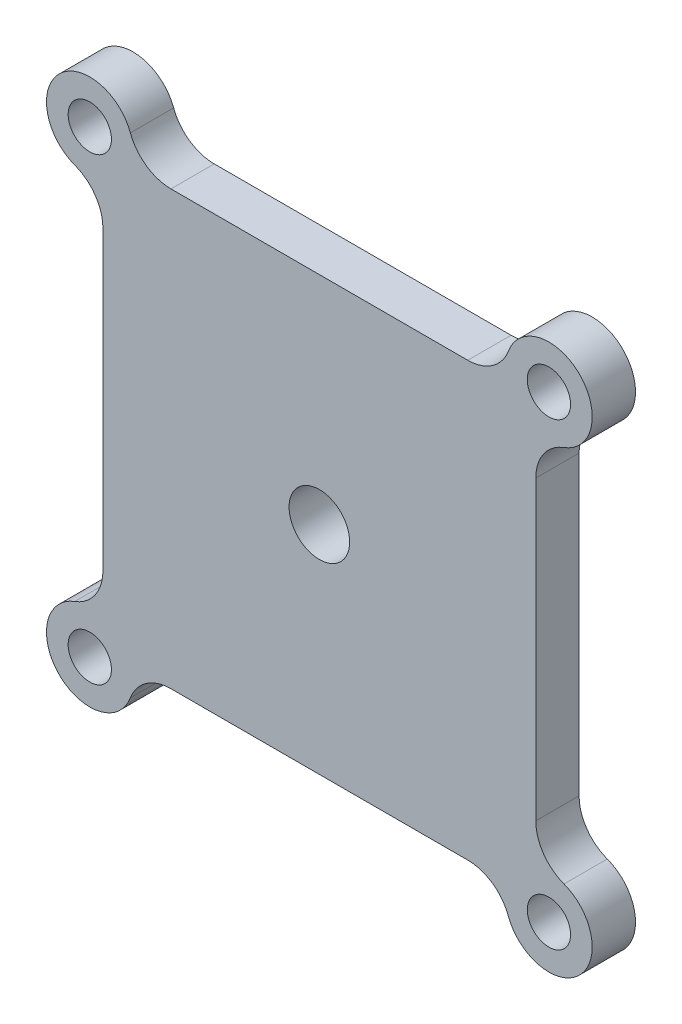
ISO-10303-21;
HEADER;
FILE_DESCRIPTION(('STEP AP214'),'2;1');
FILE_NAME('part.step','',(''),(''),'','','');
FILE_SCHEMA(('AUTOMOTIVE_DESIGN { 1 0 10303 214 1 1 1 1 }'));
ENDSEC;
DATA;
#1=APPLICATION_CONTEXT('core data for automotive mechanical design processes');
#2=APPLICATION_PROTOCOL_DEFINITION('international standard','automotive_design',2000,#1);
#3=PRODUCT_CONTEXT('',#1,'mechanical');
#4=PRODUCT('Part','Part','',(#3));
#5=PRODUCT_RELATED_PRODUCT_CATEGORY('part','',(#4));
#6=PRODUCT_DEFINITION_FORMATION('','',#4);
#7=PRODUCT_DEFINITION_CONTEXT('part definition',#1,'design');
#8=PRODUCT_DEFINITION('design','',#6,#7);
#9=PRODUCT_DEFINITION_SHAPE('','',#8);
#10=(LENGTH_UNIT() NAMED_UNIT(*) SI_UNIT(.MILLI.,.METRE.));
#11=(NAMED_UNIT(*) PLANE_ANGLE_UNIT() SI_UNIT($,.RADIAN.));
#12=(NAMED_UNIT(*) SI_UNIT($,.STERADIAN.) SOLID_ANGLE_UNIT());
#13=UNCERTAINTY_MEASURE_WITH_UNIT(LENGTH_MEASURE(1.E-05),#10,'distance_accuracy_value','');
#14=(GEOMETRIC_REPRESENTATION_CONTEXT(3) GLOBAL_UNCERTAINTY_ASSIGNED_CONTEXT((#13)) GLOBAL_UNIT_ASSIGNED_CONTEXT((#10,
#11,#12)) REPRESENTATION_CONTEXT('',''));
#15=CARTESIAN_POINT('',(0.,0.,0.));
#16=DIRECTION('',(0.,0.,1.));
#17=DIRECTION('',(1.,0.,0.));
#18=AXIS2_PLACEMENT_3D('',#15,#16,#17);
#19=CARTESIAN_POINT('',(-17.1428573163983,30.,5.));
#20=DIRECTION('',(0.,0.,-1.));
#21=DIRECTION('',(-1.,0.,0.));
#22=AXIS2_PLACEMENT_3D('',#19,#20,#21);
#23=PLANE('',#22);
#24=CARTESIAN_POINT('',(-17.1428573163983,30.,5.));
#25=DIRECTION('',(0.,0.,-1.));
#26=DIRECTION('',(-1.,0.,0.));
#27=AXIS2_PLACEMENT_3D('',#24,#25,#26);
#28=CIRCLE('',#27,5.);
#29=CARTESIAN_POINT('',(-17.1428573163983,25.,5.));
#30=VERTEX_POINT('',#29);
#31=CARTESIAN_POINT('',(-21.8296808054419,28.2582521472528,5.));
#32=VERTEX_POINT('',#31);
#33=EDGE_CURVE('E215',#30,#32,#28,.T.);
#34=ORIENTED_EDGE('',*,*,#33,.T.);
#35=CARTESIAN_POINT('',(-26.5165042944855,26.5165042945056,5.));
#36=DIRECTION('',(0.,0.,1.));
#37=DIRECTION('',(1.,0.,0.));
#38=AXIS2_PLACEMENT_3D('',#35,#36,#37);
#39=CIRCLE('',#38,5.);
#40=CARTESIAN_POINT('',(-28.2582521472427,21.8296808054658,5.));
#41=VERTEX_POINT('',#40);
#42=EDGE_CURVE('E123',#32,#41,#39,.T.);
#43=ORIENTED_EDGE('',*,*,#42,.T.);
#44=CARTESIAN_POINT('',(-30.,17.142857316426,5.));
#45=DIRECTION('',(0.,0.,-1.));
#46=DIRECTION('',(1.,0.,0.));
#47=AXIS2_PLACEMENT_3D('',#44,#45,#46);
#48=CIRCLE('',#47,5.);
#49=CARTESIAN_POINT('',(-25.,17.142857316426,5.));
#50=VERTEX_POINT('',#49);
#51=EDGE_CURVE('E254',#41,#50,#48,.T.);
#52=ORIENTED_EDGE('',*,*,#51,.T.);
#53=DIRECTION('',(0.,-1.,0.));
#54=VECTOR('',#53,1.);
#55=CARTESIAN_POINT('',(-25.0000000000002,-17.142857316398,5.));
#56=LINE('',#55,#54);
#57=CARTESIAN_POINT('',(-25.0000000000002,-17.142857316398,5.));
#58=VERTEX_POINT('',#57);
#59=EDGE_CURVE('E273',#50,#58,#56,.T.);
#60=ORIENTED_EDGE('',*,*,#59,.T.);
#61=CARTESIAN_POINT('',(-30.0000000000002,-17.142857316398,5.));
#62=DIRECTION('',(0.,0.,-1.));
#63=DIRECTION('',(-1.,0.,0.));
#64=AXIS2_PLACEMENT_3D('',#61,#62,#63);
#65=CIRCLE('',#64,5.);
#66=CARTESIAN_POINT('',(-28.258252147253,-21.8296808054416,5.));
#67=VERTEX_POINT('',#66);
#68=EDGE_CURVE('E270',#58,#67,#65,.T.);
#69=ORIENTED_EDGE('',*,*,#68,.T.);
#70=CARTESIAN_POINT('',(-26.5165042945059,-26.5165042944852,5.));
#71=DIRECTION('',(0.,0.,1.));
#72=DIRECTION('',(1.,0.,0.));
#73=AXIS2_PLACEMENT_3D('',#70,#71,#72);
#74=CIRCLE('',#73,5.);
#75=CARTESIAN_POINT('',(-21.8296808054661,-28.2582521472425,5.));
#76=VERTEX_POINT('',#75);
#77=EDGE_CURVE('E272',#67,#76,#74,.T.);
#78=ORIENTED_EDGE('',*,*,#77,.T.);
#79=CARTESIAN_POINT('',(-17.1428573164263,-29.9999999999998,5.));
#80=DIRECTION('',(0.,0.,-1.));
#81=DIRECTION('',(1.,0.,0.));
#82=AXIS2_PLACEMENT_3D('',#79,#80,#81);
#83=CIRCLE('',#82,5.);
#84=CARTESIAN_POINT('',(-17.1428573164262,-24.9999999999998,5.));
#85=VERTEX_POINT('',#84);
#86=EDGE_CURVE('E275',#76,#85,#83,.T.);
#87=ORIENTED_EDGE('',*,*,#86,.T.);
#88=DIRECTION('',(1.,0.,0.));
#89=VECTOR('',#88,1.);
#90=CARTESIAN_POINT('',(-17.1428573164262,-24.9999999999998,5.));
#91=LINE('',#90,#89);
#92=CARTESIAN_POINT('',(17.1428573163981,-25.0000000000001,5.));
#93=VERTEX_POINT('',#92);
#94=EDGE_CURVE('E281',#85,#93,#91,.T.);
#95=ORIENTED_EDGE('',*,*,#94,.T.);
#96=CARTESIAN_POINT('',(17.1428573163981,-30.0000000000001,5.));
#97=DIRECTION('',(0.,0.,-1.));
#98=DIRECTION('',(-1.,0.,0.));
#99=AXIS2_PLACEMENT_3D('',#96,#97,#98);
#100=CIRCLE('',#99,5.);
#101=CARTESIAN_POINT('',(21.8296808054417,-28.258252147253,5.));
#102=VERTEX_POINT('',#101);
#103=EDGE_CURVE('E283',#93,#102,#100,.T.);
#104=ORIENTED_EDGE('',*,*,#103,.T.);
#105=CARTESIAN_POINT('',(26.5165042944853,-26.5165042945058,5.));
#106=DIRECTION('',(0.,0.,1.));
#107=DIRECTION('',(1.,0.,0.));
#108=AXIS2_PLACEMENT_3D('',#105,#106,#107);
#109=CIRCLE('',#108,5.);
#110=CARTESIAN_POINT('',(28.2582521472426,-21.829680805466,5.));
#111=VERTEX_POINT('',#110);
#112=EDGE_CURVE('E285',#102,#111,#109,.T.);
#113=ORIENTED_EDGE('',*,*,#112,.T.);
#114=CARTESIAN_POINT('',(29.9999999999999,-17.1428573164262,5.));
#115=DIRECTION('',(0.,0.,-1.));
#116=DIRECTION('',(1.,0.,0.));
#117=AXIS2_PLACEMENT_3D('',#114,#115,#116);
#118=CIRCLE('',#117,5.);
#119=CARTESIAN_POINT('',(24.9999999999999,-17.1428573164262,5.));
#120=VERTEX_POINT('',#119);
#121=EDGE_CURVE('E287',#111,#120,#118,.T.);
#122=ORIENTED_EDGE('',*,*,#121,.T.);
#123=DIRECTION('',(0.,1.,0.));
#124=VECTOR('',#123,1.);
#125=CARTESIAN_POINT('',(24.9999999999999,-17.1428573164262,5.));
#126=LINE('',#125,#124);
#127=CARTESIAN_POINT('',(25.0000000000001,17.1428573163982,5.));
#128=VERTEX_POINT('',#127);
#129=EDGE_CURVE('E289',#120,#128,#126,.T.);
#130=ORIENTED_EDGE('',*,*,#129,.T.);
#131=CARTESIAN_POINT('',(30.0000000000001,17.1428573163982,5.));
#132=DIRECTION('',(0.,0.,-1.));
#133=DIRECTION('',(-1.,0.,0.));
#134=AXIS2_PLACEMENT_3D('',#131,#132,#133);
#135=CIRCLE('',#134,5.);
#136=CARTESIAN_POINT('',(28.2582521472529,21.8296808054418,5.));
#137=VERTEX_POINT('',#136);
#138=EDGE_CURVE('E166',#128,#137,#135,.T.);
#139=ORIENTED_EDGE('',*,*,#138,.T.);
#140=CARTESIAN_POINT('',(26.5165042945057,26.5165042944854,5.));
#141=DIRECTION('',(0.,0.,1.));
#142=DIRECTION('',(1.,0.,0.));
#143=AXIS2_PLACEMENT_3D('',#140,#141,#142);
#144=CIRCLE('',#143,5.);
#145=CARTESIAN_POINT('',(21.8296808054659,28.2582521472426,5.));
#146=VERTEX_POINT('',#145);
#147=EDGE_CURVE('E160',#137,#146,#144,.T.);
#148=ORIENTED_EDGE('',*,*,#147,.T.);
#149=CARTESIAN_POINT('',(17.1428573164261,29.9999999999999,5.));
#150=DIRECTION('',(0.,0.,-1.));
#151=DIRECTION('',(1.,0.,0.));
#152=AXIS2_PLACEMENT_3D('',#149,#150,#151);
#153=CIRCLE('',#152,5.);
#154=CARTESIAN_POINT('',(17.1428573164261,24.9999999999999,5.));
#155=VERTEX_POINT('',#154);
#156=EDGE_CURVE('E164',#146,#155,#153,.T.);
#157=ORIENTED_EDGE('',*,*,#156,.T.);
#158=DIRECTION('',(-1.,0.,0.));
#159=VECTOR('',#158,1.);
#160=CARTESIAN_POINT('',(-17.1428573163983,25.,5.));
#161=LINE('',#160,#159);
#162=EDGE_CURVE('E56',#155,#30,#161,.T.);
#163=ORIENTED_EDGE('',*,*,#162,.T.);
#164=EDGE_LOOP('',(#34,#43,#52,#60,#69,#78,#87,#95,#104,#113,#122,#130,#139,#148,#157,#163));
#165=FACE_BOUND('',#164,.T.);
#166=CARTESIAN_POINT('',(0.,0.,5.));
#167=DIRECTION('',(0.,0.,1.));
#168=DIRECTION('',(1.,0.,0.));
#169=AXIS2_PLACEMENT_3D('',#166,#167,#168);
#170=CIRCLE('',#169,3.5);
#171=CARTESIAN_POINT('',(3.5,0.,5.));
#172=VERTEX_POINT('',#171);
#173=EDGE_CURVE('E188',#172,#172,#170,.T.);
#174=ORIENTED_EDGE('',*,*,#173,.F.);
#175=EDGE_LOOP('',(#174));
#176=FACE_BOUND('',#175,.T.);
#177=CARTESIAN_POINT('',(-26.5165042944855,26.5165042945056,5.));
#178=DIRECTION('',(0.,0.,1.));
#179=DIRECTION('',(1.,0.,0.));
#180=AXIS2_PLACEMENT_3D('',#177,#178,#179);
#181=CIRCLE('',#180,2.5);
#182=CARTESIAN_POINT('',(-24.0165042944855,26.5165042945056,5.));
#183=VERTEX_POINT('',#182);
#184=EDGE_CURVE('E363',#183,#183,#181,.T.);
#185=ORIENTED_EDGE('',*,*,#184,.F.);
#186=EDGE_LOOP('',(#185));
#187=FACE_BOUND('',#186,.T.);
#188=CARTESIAN_POINT('',(26.5165042945057,26.5165042944854,5.));
#189=DIRECTION('',(0.,0.,1.));
#190=DIRECTION('',(1.,0.,0.));
#191=AXIS2_PLACEMENT_3D('',#188,#189,#190);
#192=CIRCLE('',#191,2.5);
#193=CARTESIAN_POINT('',(29.0165042945057,26.5165042944854,5.));
#194=VERTEX_POINT('',#193);
#195=EDGE_CURVE('E357',#194,#194,#192,.T.);
#196=ORIENTED_EDGE('',*,*,#195,.F.);
#197=EDGE_LOOP('',(#196));
#198=FACE_BOUND('',#197,.T.);
#199=CARTESIAN_POINT('',(26.5165042944853,-26.5165042945058,5.));
#200=DIRECTION('',(0.,0.,1.));
#201=DIRECTION('',(1.,0.,0.));
#202=AXIS2_PLACEMENT_3D('',#199,#200,#201);
#203=CIRCLE('',#202,2.5);
#204=CARTESIAN_POINT('',(29.0165042944853,-26.5165042945058,5.));
#205=VERTEX_POINT('',#204);
#206=EDGE_CURVE('E351',#205,#205,#203,.T.);
#207=ORIENTED_EDGE('',*,*,#206,.F.);
#208=EDGE_LOOP('',(#207));
#209=FACE_BOUND('',#208,.T.);
#210=CARTESIAN_POINT('',(-26.5165042945059,-26.5165042944852,5.));
#211=DIRECTION('',(0.,0.,1.));
#212=DIRECTION('',(1.,0.,0.));
#213=AXIS2_PLACEMENT_3D('',#210,#211,#212);
#214=CIRCLE('',#213,2.5);
#215=CARTESIAN_POINT('',(-24.0165042945059,-26.5165042944852,5.));
#216=VERTEX_POINT('',#215);
#217=EDGE_CURVE('E342',#216,#216,#214,.T.);
#218=ORIENTED_EDGE('',*,*,#217,.F.);
#219=EDGE_LOOP('',(#218));
#220=FACE_BOUND('',#219,.T.);
#221=ADVANCED_FACE('F39',(#165,#176,#187,#198,#209,#220),#23,.F.);
#222=CARTESIAN_POINT('',(-17.1428573163983,30.,0.));
#223=DIRECTION('',(0.,0.,-1.));
#224=DIRECTION('',(-1.,0.,0.));
#225=AXIS2_PLACEMENT_3D('',#222,#223,#224);
#226=PLANE('',#225);
#227=CARTESIAN_POINT('',(26.5165042944853,-26.5165042945058,0.));
#228=DIRECTION('',(0.,0.,1.));
#229=DIRECTION('',(1.,0.,0.));
#230=AXIS2_PLACEMENT_3D('',#227,#228,#229);
#231=CIRCLE('',#230,2.5);
#232=CARTESIAN_POINT('',(29.0165042944853,-26.5165042945058,0.));
#233=VERTEX_POINT('',#232);
#234=EDGE_CURVE('E348',#233,#233,#231,.T.);
#235=ORIENTED_EDGE('',*,*,#234,.T.);
#236=EDGE_LOOP('',(#235));
#237=FACE_BOUND('',#236,.T.);
#238=CARTESIAN_POINT('',(-26.5165042944855,26.5165042945056,0.));
#239=DIRECTION('',(0.,0.,1.));
#240=DIRECTION('',(1.,0.,0.));
#241=AXIS2_PLACEMENT_3D('',#238,#239,#240);
#242=CIRCLE('',#241,2.5);
#243=CARTESIAN_POINT('',(-24.0165042944855,26.5165042945056,0.));
#244=VERTEX_POINT('',#243);
#245=EDGE_CURVE('E360',#244,#244,#242,.T.);
#246=ORIENTED_EDGE('',*,*,#245,.T.);
#247=EDGE_LOOP('',(#246));
#248=FACE_BOUND('',#247,.T.);
#249=CARTESIAN_POINT('',(-17.1428573163983,30.,0.));
#250=DIRECTION('',(0.,0.,-1.));
#251=DIRECTION('',(-1.,0.,0.));
#252=AXIS2_PLACEMENT_3D('',#249,#250,#251);
#253=CIRCLE('',#252,5.);
#254=CARTESIAN_POINT('',(-17.1428573163983,25.,0.));
#255=VERTEX_POINT('',#254);
#256=CARTESIAN_POINT('',(-21.8296808054419,28.2582521472528,0.));
#257=VERTEX_POINT('',#256);
#258=EDGE_CURVE('E184',#255,#257,#253,.T.);
#259=ORIENTED_EDGE('',*,*,#258,.F.);
#260=DIRECTION('',(-1.,0.,0.));
#261=VECTOR('',#260,1.);
#262=CARTESIAN_POINT('',(-17.1428573163983,25.,0.));
#263=LINE('',#262,#261);
#264=CARTESIAN_POINT('',(17.1428573164261,24.9999999999999,0.));
#265=VERTEX_POINT('',#264);
#266=EDGE_CURVE('E115',#265,#255,#263,.T.);
#267=ORIENTED_EDGE('',*,*,#266,.F.);
#268=CARTESIAN_POINT('',(17.1428573164261,29.9999999999999,0.));
#269=DIRECTION('',(0.,0.,-1.));
#270=DIRECTION('',(1.,0.,0.));
#271=AXIS2_PLACEMENT_3D('',#268,#269,#270);
#272=CIRCLE('',#271,5.);
#273=CARTESIAN_POINT('',(21.8296808054659,28.2582521472426,0.));
#274=VERTEX_POINT('',#273);
#275=EDGE_CURVE('E109',#274,#265,#272,.T.);
#276=ORIENTED_EDGE('',*,*,#275,.F.);
#277=CARTESIAN_POINT('',(26.5165042945057,26.5165042944854,0.));
#278=DIRECTION('',(0.,0.,1.));
#279=DIRECTION('',(1.,0.,0.));
#280=AXIS2_PLACEMENT_3D('',#277,#278,#279);
#281=CIRCLE('',#280,5.);
#282=CARTESIAN_POINT('',(28.2582521472529,21.8296808054418,0.));
#283=VERTEX_POINT('',#282);
#284=EDGE_CURVE('E174',#283,#274,#281,.T.);
#285=ORIENTED_EDGE('',*,*,#284,.F.);
#286=CARTESIAN_POINT('',(30.0000000000001,17.1428573163982,0.));
#287=DIRECTION('',(0.,0.,-1.));
#288=DIRECTION('',(-1.,0.,0.));
#289=AXIS2_PLACEMENT_3D('',#286,#287,#288);
#290=CIRCLE('',#289,5.);
#291=CARTESIAN_POINT('',(25.0000000000001,17.1428573163982,0.));
#292=VERTEX_POINT('',#291);
#293=EDGE_CURVE('E210',#292,#283,#290,.T.);
#294=ORIENTED_EDGE('',*,*,#293,.F.);
#295=DIRECTION('',(0.,1.,0.));
#296=VECTOR('',#295,1.);
#297=CARTESIAN_POINT('',(24.9999999999999,-17.1428573164262,0.));
#298=LINE('',#297,#296);
#299=CARTESIAN_POINT('',(24.9999999999999,-17.1428573164262,0.));
#300=VERTEX_POINT('',#299);
#301=EDGE_CURVE('E208',#300,#292,#298,.T.);
#302=ORIENTED_EDGE('',*,*,#301,.F.);
#303=CARTESIAN_POINT('',(29.9999999999999,-17.1428573164262,0.));
#304=DIRECTION('',(0.,0.,-1.));
#305=DIRECTION('',(1.,0.,0.));
#306=AXIS2_PLACEMENT_3D('',#303,#304,#305);
#307=CIRCLE('',#306,5.);
#308=CARTESIAN_POINT('',(28.2582521472426,-21.829680805466,0.));
#309=VERTEX_POINT('',#308);
#310=EDGE_CURVE('E206',#309,#300,#307,.T.);
#311=ORIENTED_EDGE('',*,*,#310,.F.);
#312=CARTESIAN_POINT('',(26.5165042944853,-26.5165042945058,0.));
#313=DIRECTION('',(0.,0.,1.));
#314=DIRECTION('',(1.,0.,0.));
#315=AXIS2_PLACEMENT_3D('',#312,#313,#314);
#316=CIRCLE('',#315,5.);
#317=CARTESIAN_POINT('',(21.8296808054417,-28.258252147253,0.));
#318=VERTEX_POINT('',#317);
#319=EDGE_CURVE('E204',#318,#309,#316,.T.);
#320=ORIENTED_EDGE('',*,*,#319,.F.);
#321=CARTESIAN_POINT('',(17.1428573163981,-30.0000000000001,0.));
#322=DIRECTION('',(0.,0.,-1.));
#323=DIRECTION('',(-1.,0.,0.));
#324=AXIS2_PLACEMENT_3D('',#321,#322,#323);
#325=CIRCLE('',#324,5.);
#326=CARTESIAN_POINT('',(17.1428573163981,-25.0000000000001,0.));
#327=VERTEX_POINT('',#326);
#328=EDGE_CURVE('E202',#327,#318,#325,.T.);
#329=ORIENTED_EDGE('',*,*,#328,.F.);
#330=DIRECTION('',(1.,0.,0.));
#331=VECTOR('',#330,1.);
#332=CARTESIAN_POINT('',(-17.1428573164262,-24.9999999999998,0.));
#333=LINE('',#332,#331);
#334=CARTESIAN_POINT('',(-17.1428573164262,-24.9999999999998,0.));
#335=VERTEX_POINT('',#334);
#336=EDGE_CURVE('E200',#335,#327,#333,.T.);
#337=ORIENTED_EDGE('',*,*,#336,.F.);
#338=CARTESIAN_POINT('',(-17.1428573164263,-29.9999999999998,0.));
#339=DIRECTION('',(0.,0.,-1.));
#340=DIRECTION('',(1.,0.,0.));
#341=AXIS2_PLACEMENT_3D('',#338,#339,#340);
#342=CIRCLE('',#341,5.);
#343=CARTESIAN_POINT('',(-21.8296808054661,-28.2582521472425,0.));
#344=VERTEX_POINT('',#343);
#345=EDGE_CURVE('E198',#344,#335,#342,.T.);
#346=ORIENTED_EDGE('',*,*,#345,.F.);
#347=CARTESIAN_POINT('',(-26.5165042945059,-26.5165042944852,0.));
#348=DIRECTION('',(0.,0.,1.));
#349=DIRECTION('',(1.,0.,0.));
#350=AXIS2_PLACEMENT_3D('',#347,#348,#349);
#351=CIRCLE('',#350,5.);
#352=CARTESIAN_POINT('',(-28.258252147253,-21.8296808054416,0.));
#353=VERTEX_POINT('',#352);
#354=EDGE_CURVE('E196',#353,#344,#351,.T.);
#355=ORIENTED_EDGE('',*,*,#354,.F.);
#356=CARTESIAN_POINT('',(-30.0000000000002,-17.142857316398,0.));
#357=DIRECTION('',(0.,0.,-1.));
#358=DIRECTION('',(-1.,0.,0.));
#359=AXIS2_PLACEMENT_3D('',#356,#357,#358);
#360=CIRCLE('',#359,5.);
#361=CARTESIAN_POINT('',(-25.0000000000002,-17.142857316398,0.));
#362=VERTEX_POINT('',#361);
#363=EDGE_CURVE('E194',#362,#353,#360,.T.);
#364=ORIENTED_EDGE('',*,*,#363,.F.);
#365=DIRECTION('',(0.,-1.,0.));
#366=VECTOR('',#365,1.);
#367=CARTESIAN_POINT('',(-25.0000000000002,-17.142857316398,0.));
#368=LINE('',#367,#366);
#369=CARTESIAN_POINT('',(-25.,17.142857316426,0.));
#370=VERTEX_POINT('',#369);
#371=EDGE_CURVE('E192',#370,#362,#368,.T.);
#372=ORIENTED_EDGE('',*,*,#371,.F.);
#373=CARTESIAN_POINT('',(-30.,17.142857316426,0.));
#374=DIRECTION('',(0.,0.,-1.));
#375=DIRECTION('',(1.,0.,0.));
#376=AXIS2_PLACEMENT_3D('',#373,#374,#375);
#377=CIRCLE('',#376,5.);
#378=CARTESIAN_POINT('',(-28.2582521472427,21.8296808054658,0.));
#379=VERTEX_POINT('',#378);
#380=EDGE_CURVE('E190',#379,#370,#377,.T.);
#381=ORIENTED_EDGE('',*,*,#380,.F.);
#382=CARTESIAN_POINT('',(-26.5165042944855,26.5165042945056,0.));
#383=DIRECTION('',(0.,0.,1.));
#384=DIRECTION('',(1.,0.,0.));
#385=AXIS2_PLACEMENT_3D('',#382,#383,#384);
#386=CIRCLE('',#385,5.);
#387=EDGE_CURVE('E187',#257,#379,#386,.T.);
#388=ORIENTED_EDGE('',*,*,#387,.F.);
#389=EDGE_LOOP('',(#259,#267,#276,#285,#294,#302,#311,#320,#329,#337,#346,#355,#364,#372,#381,#388));
#390=FACE_BOUND('',#389,.T.);
#391=CARTESIAN_POINT('',(0.,0.,0.));
#392=DIRECTION('',(0.,0.,1.));
#393=DIRECTION('',(1.,0.,0.));
#394=AXIS2_PLACEMENT_3D('',#391,#392,#393);
#395=CIRCLE('',#394,3.5);
#396=CARTESIAN_POINT('',(3.5,0.,0.));
#397=VERTEX_POINT('',#396);
#398=EDGE_CURVE('E366',#397,#397,#395,.T.);
#399=ORIENTED_EDGE('',*,*,#398,.T.);
#400=EDGE_LOOP('',(#399));
#401=FACE_BOUND('',#400,.T.);
#402=CARTESIAN_POINT('',(26.5165042945057,26.5165042944854,0.));
#403=DIRECTION('',(0.,0.,1.));
#404=DIRECTION('',(1.,0.,0.));
#405=AXIS2_PLACEMENT_3D('',#402,#403,#404);
#406=CIRCLE('',#405,2.5);
#407=CARTESIAN_POINT('',(29.0165042945057,26.5165042944854,0.));
#408=VERTEX_POINT('',#407);
#409=EDGE_CURVE('E354',#408,#408,#406,.T.);
#410=ORIENTED_EDGE('',*,*,#409,.T.);
#411=EDGE_LOOP('',(#410));
#412=FACE_BOUND('',#411,.T.);
#413=CARTESIAN_POINT('',(-26.5165042945059,-26.5165042944852,0.));
#414=DIRECTION('',(0.,0.,1.));
#415=DIRECTION('',(1.,0.,0.));
#416=AXIS2_PLACEMENT_3D('',#413,#414,#415);
#417=CIRCLE('',#416,2.5);
#418=CARTESIAN_POINT('',(-24.0165042945059,-26.5165042944852,0.));
#419=VERTEX_POINT('',#418);
#420=EDGE_CURVE('E345',#419,#419,#417,.T.);
#421=ORIENTED_EDGE('',*,*,#420,.T.);
#422=EDGE_LOOP('',(#421));
#423=FACE_BOUND('',#422,.T.);
#424=ADVANCED_FACE('F258',(#237,#248,#390,#401,#412,#423),#226,.T.);
#425=CARTESIAN_POINT('',(-17.1428573163983,30.,5.));
#426=DIRECTION('',(0.,0.,-1.));
#427=DIRECTION('',(-1.,0.,0.));
#428=AXIS2_PLACEMENT_3D('',#425,#426,#427);
#429=CYLINDRICAL_SURFACE('',#428,5.);
#430=ORIENTED_EDGE('',*,*,#258,.T.);
#431=DIRECTION('',(0.,0.,-1.));
#432=VECTOR('',#431,1.);
#433=CARTESIAN_POINT('',(-21.8296808054419,28.2582521472528,5.));
#434=LINE('',#433,#432);
#435=EDGE_CURVE('E11',#32,#257,#434,.T.);
#436=ORIENTED_EDGE('',*,*,#435,.F.);
#437=ORIENTED_EDGE('',*,*,#33,.F.);
#438=DIRECTION('',(0.,0.,-1.));
#439=VECTOR('',#438,1.);
#440=CARTESIAN_POINT('',(-17.1428573163983,25.,5.));
#441=LINE('',#440,#439);
#442=EDGE_CURVE('E180',#30,#255,#441,.T.);
#443=ORIENTED_EDGE('',*,*,#442,.T.);
#444=EDGE_LOOP('',(#430,#436,#437,#443));
#445=FACE_BOUND('',#444,.T.);
#446=ADVANCED_FACE('F41',(#445),#429,.F.);
#447=CARTESIAN_POINT('',(-26.5165042944855,26.5165042945056,5.));
#448=DIRECTION('',(0.,0.,-1.));
#449=DIRECTION('',(-1.,0.,0.));
#450=AXIS2_PLACEMENT_3D('',#447,#448,#449);
#451=CYLINDRICAL_SURFACE('',#450,5.);
#452=ORIENTED_EDGE('',*,*,#387,.T.);
#453=DIRECTION('',(0.,0.,-1.));
#454=VECTOR('',#453,1.);
#455=CARTESIAN_POINT('',(-28.2582521472427,21.8296808054658,5.));
#456=LINE('',#455,#454);
#457=EDGE_CURVE('E48',#41,#379,#456,.T.);
#458=ORIENTED_EDGE('',*,*,#457,.F.);
#459=ORIENTED_EDGE('',*,*,#42,.F.);
#460=ORIENTED_EDGE('',*,*,#435,.T.);
#461=EDGE_LOOP('',(#452,#458,#459,#460));
#462=FACE_BOUND('',#461,.T.);
#463=ADVANCED_FACE('F527',(#462),#451,.T.);
#464=CARTESIAN_POINT('',(-30.,17.142857316426,5.));
#465=DIRECTION('',(0.,0.,-1.));
#466=DIRECTION('',(-1.,0.,0.));
#467=AXIS2_PLACEMENT_3D('',#464,#465,#466);
#468=CYLINDRICAL_SURFACE('',#467,5.);
#469=ORIENTED_EDGE('',*,*,#380,.T.);
#470=DIRECTION('',(0.,0.,-1.));
#471=VECTOR('',#470,1.);
#472=CARTESIAN_POINT('',(-25.,17.142857316426,5.));
#473=LINE('',#472,#471);
#474=EDGE_CURVE('E246',#50,#370,#473,.T.);
#475=ORIENTED_EDGE('',*,*,#474,.F.);
#476=ORIENTED_EDGE('',*,*,#51,.F.);
#477=ORIENTED_EDGE('',*,*,#457,.T.);
#478=EDGE_LOOP('',(#469,#475,#476,#477));
#479=FACE_BOUND('',#478,.T.);
#480=ADVANCED_FACE('F252',(#479),#468,.F.);
#481=CARTESIAN_POINT('',(-25.0000000000002,-17.142857316398,5.));
#482=DIRECTION('',(1.,0.,0.));
#483=DIRECTION('',(0.,1.,0.));
#484=AXIS2_PLACEMENT_3D('',#481,#482,#483);
#485=PLANE('',#484);
#486=ORIENTED_EDGE('',*,*,#371,.T.);
#487=DIRECTION('',(0.,0.,-1.));
#488=VECTOR('',#487,1.);
#489=CARTESIAN_POINT('',(-25.0000000000002,-17.142857316398,5.));
#490=LINE('',#489,#488);
#491=EDGE_CURVE('E243',#58,#362,#490,.T.);
#492=ORIENTED_EDGE('',*,*,#491,.F.);
#493=ORIENTED_EDGE('',*,*,#59,.F.);
#494=ORIENTED_EDGE('',*,*,#474,.T.);
#495=EDGE_LOOP('',(#486,#492,#493,#494));
#496=FACE_BOUND('',#495,.T.);
#497=ADVANCED_FACE('F264',(#496),#485,.F.);
#498=CARTESIAN_POINT('',(-30.0000000000002,-17.142857316398,5.));
#499=DIRECTION('',(0.,0.,-1.));
#500=DIRECTION('',(-1.,0.,0.));
#501=AXIS2_PLACEMENT_3D('',#498,#499,#500);
#502=CYLINDRICAL_SURFACE('',#501,5.);
#503=ORIENTED_EDGE('',*,*,#363,.T.);
#504=DIRECTION('',(0.,0.,-1.));
#505=VECTOR('',#504,1.);
#506=CARTESIAN_POINT('',(-28.258252147253,-21.8296808054416,5.));
#507=LINE('',#506,#505);
#508=EDGE_CURVE('E240',#67,#353,#507,.T.);
#509=ORIENTED_EDGE('',*,*,#508,.F.);
#510=ORIENTED_EDGE('',*,*,#68,.F.);
#511=ORIENTED_EDGE('',*,*,#491,.T.);
#512=EDGE_LOOP('',(#503,#509,#510,#511));
#513=FACE_BOUND('',#512,.T.);
#514=ADVANCED_FACE('F268',(#513),#502,.F.);
#515=CARTESIAN_POINT('',(-26.5165042945059,-26.5165042944852,5.));
#516=DIRECTION('',(0.,0.,-1.));
#517=DIRECTION('',(-1.,0.,0.));
#518=AXIS2_PLACEMENT_3D('',#515,#516,#517);
#519=CYLINDRICAL_SURFACE('',#518,5.);
#520=ORIENTED_EDGE('',*,*,#354,.T.);
#521=DIRECTION('',(0.,0.,-1.));
#522=VECTOR('',#521,1.);
#523=CARTESIAN_POINT('',(-21.8296808054661,-28.2582521472425,5.));
#524=LINE('',#523,#522);
#525=EDGE_CURVE('E237',#76,#344,#524,.T.);
#526=ORIENTED_EDGE('',*,*,#525,.F.);
#527=ORIENTED_EDGE('',*,*,#77,.F.);
#528=ORIENTED_EDGE('',*,*,#508,.T.);
#529=EDGE_LOOP('',(#520,#526,#527,#528));
#530=FACE_BOUND('',#529,.T.);
#531=ADVANCED_FACE('F492',(#530),#519,.T.);
#532=CARTESIAN_POINT('',(-17.1428573164263,-29.9999999999998,5.));
#533=DIRECTION('',(0.,0.,-1.));
#534=DIRECTION('',(-1.,0.,0.));
#535=AXIS2_PLACEMENT_3D('',#532,#533,#534);
#536=CYLINDRICAL_SURFACE('',#535,5.);
#537=ORIENTED_EDGE('',*,*,#345,.T.);
#538=DIRECTION('',(0.,0.,-1.));
#539=VECTOR('',#538,1.);
#540=CARTESIAN_POINT('',(-17.1428573164262,-24.9999999999998,5.));
#541=LINE('',#540,#539);
#542=EDGE_CURVE('E234',#85,#335,#541,.T.);
#543=ORIENTED_EDGE('',*,*,#542,.F.);
#544=ORIENTED_EDGE('',*,*,#86,.F.);
#545=ORIENTED_EDGE('',*,*,#525,.T.);
#546=EDGE_LOOP('',(#537,#543,#544,#545));
#547=FACE_BOUND('',#546,.T.);
#548=ADVANCED_FACE('F482',(#547),#536,.F.);
#549=CARTESIAN_POINT('',(-17.1428573164262,-24.9999999999998,5.));
#550=DIRECTION('',(0.,1.,0.));
#551=DIRECTION('',(-1.,0.,0.));
#552=AXIS2_PLACEMENT_3D('',#549,#550,#551);
#553=PLANE('',#552);
#554=ORIENTED_EDGE('',*,*,#336,.T.);
#555=DIRECTION('',(0.,0.,-1.));
#556=VECTOR('',#555,1.);
#557=CARTESIAN_POINT('',(17.1428573163981,-25.0000000000001,5.));
#558=LINE('',#557,#556);
#559=EDGE_CURVE('E231',#93,#327,#558,.T.);
#560=ORIENTED_EDGE('',*,*,#559,.F.);
#561=ORIENTED_EDGE('',*,*,#94,.F.);
#562=ORIENTED_EDGE('',*,*,#542,.T.);
#563=EDGE_LOOP('',(#554,#560,#561,#562));
#564=FACE_BOUND('',#563,.T.);
#565=ADVANCED_FACE('F472',(#564),#553,.F.);
#566=CARTESIAN_POINT('',(17.1428573163981,-30.0000000000001,5.));
#567=DIRECTION('',(0.,0.,-1.));
#568=DIRECTION('',(-1.,0.,0.));
#569=AXIS2_PLACEMENT_3D('',#566,#567,#568);
#570=CYLINDRICAL_SURFACE('',#569,5.);
#571=ORIENTED_EDGE('',*,*,#328,.T.);
#572=DIRECTION('',(0.,0.,-1.));
#573=VECTOR('',#572,1.);
#574=CARTESIAN_POINT('',(21.8296808054417,-28.258252147253,5.));
#575=LINE('',#574,#573);
#576=EDGE_CURVE('E228',#102,#318,#575,.T.);
#577=ORIENTED_EDGE('',*,*,#576,.F.);
#578=ORIENTED_EDGE('',*,*,#103,.F.);
#579=ORIENTED_EDGE('',*,*,#559,.T.);
#580=EDGE_LOOP('',(#571,#577,#578,#579));
#581=FACE_BOUND('',#580,.T.);
#582=ADVANCED_FACE('F462',(#581),#570,.F.);
#583=CARTESIAN_POINT('',(26.5165042944853,-26.5165042945058,5.));
#584=DIRECTION('',(0.,0.,-1.));
#585=DIRECTION('',(-1.,0.,0.));
#586=AXIS2_PLACEMENT_3D('',#583,#584,#585);
#587=CYLINDRICAL_SURFACE('',#586,5.);
#588=ORIENTED_EDGE('',*,*,#319,.T.);
#589=DIRECTION('',(0.,0.,-1.));
#590=VECTOR('',#589,1.);
#591=CARTESIAN_POINT('',(28.2582521472426,-21.829680805466,5.));
#592=LINE('',#591,#590);
#593=EDGE_CURVE('E225',#111,#309,#592,.T.);
#594=ORIENTED_EDGE('',*,*,#593,.F.);
#595=ORIENTED_EDGE('',*,*,#112,.F.);
#596=ORIENTED_EDGE('',*,*,#576,.T.);
#597=EDGE_LOOP('',(#588,#594,#595,#596));
#598=FACE_BOUND('',#597,.T.);
#599=ADVANCED_FACE('F452',(#598),#587,.T.);
#600=CARTESIAN_POINT('',(29.9999999999999,-17.1428573164262,5.));
#601=DIRECTION('',(0.,0.,-1.));
#602=DIRECTION('',(-1.,0.,0.));
#603=AXIS2_PLACEMENT_3D('',#600,#601,#602);
#604=CYLINDRICAL_SURFACE('',#603,5.);
#605=ORIENTED_EDGE('',*,*,#310,.T.);
#606=DIRECTION('',(0.,0.,-1.));
#607=VECTOR('',#606,1.);
#608=CARTESIAN_POINT('',(24.9999999999999,-17.1428573164262,5.));
#609=LINE('',#608,#607);
#610=EDGE_CURVE('E222',#120,#300,#609,.T.);
#611=ORIENTED_EDGE('',*,*,#610,.F.);
#612=ORIENTED_EDGE('',*,*,#121,.F.);
#613=ORIENTED_EDGE('',*,*,#593,.T.);
#614=EDGE_LOOP('',(#605,#611,#612,#613));
#615=FACE_BOUND('',#614,.T.);
#616=ADVANCED_FACE('F443',(#615),#604,.F.);
#617=CARTESIAN_POINT('',(24.9999999999999,-17.1428573164262,5.));
#618=DIRECTION('',(-1.,0.,0.));
#619=DIRECTION('',(0.,-1.,0.));
#620=AXIS2_PLACEMENT_3D('',#617,#618,#619);
#621=PLANE('',#620);
#622=ORIENTED_EDGE('',*,*,#301,.T.);
#623=DIRECTION('',(0.,0.,-1.));
#624=VECTOR('',#623,1.);
#625=CARTESIAN_POINT('',(25.0000000000001,17.1428573163982,5.));
#626=LINE('',#625,#624);
#627=EDGE_CURVE('E219',#128,#292,#626,.T.);
#628=ORIENTED_EDGE('',*,*,#627,.F.);
#629=ORIENTED_EDGE('',*,*,#129,.F.);
#630=ORIENTED_EDGE('',*,*,#610,.T.);
#631=EDGE_LOOP('',(#622,#628,#629,#630));
#632=FACE_BOUND('',#631,.T.);
#633=ADVANCED_FACE('F295',(#632),#621,.F.);
#634=CARTESIAN_POINT('',(30.0000000000001,17.1428573163982,5.));
#635=DIRECTION('',(0.,0.,-1.));
#636=DIRECTION('',(-1.,0.,0.));
#637=AXIS2_PLACEMENT_3D('',#634,#635,#636);
#638=CYLINDRICAL_SURFACE('',#637,5.);
#639=ORIENTED_EDGE('',*,*,#293,.T.);
#640=DIRECTION('',(0.,0.,-1.));
#641=VECTOR('',#640,1.);
#642=CARTESIAN_POINT('',(28.2582521472529,21.8296808054418,5.));
#643=LINE('',#642,#641);
#644=EDGE_CURVE('E175',#137,#283,#643,.T.);
#645=ORIENTED_EDGE('',*,*,#644,.F.);
#646=ORIENTED_EDGE('',*,*,#138,.F.);
#647=ORIENTED_EDGE('',*,*,#627,.T.);
#648=EDGE_LOOP('',(#639,#645,#646,#647));
#649=FACE_BOUND('',#648,.T.);
#650=ADVANCED_FACE('F299',(#649),#638,.F.);
#651=CARTESIAN_POINT('',(26.5165042945057,26.5165042944854,5.));
#652=DIRECTION('',(0.,0.,-1.));
#653=DIRECTION('',(-1.,0.,0.));
#654=AXIS2_PLACEMENT_3D('',#651,#652,#653);
#655=CYLINDRICAL_SURFACE('',#654,5.);
#656=ORIENTED_EDGE('',*,*,#284,.T.);
#657=DIRECTION('',(0.,0.,-1.));
#658=VECTOR('',#657,1.);
#659=CARTESIAN_POINT('',(21.8296808054659,28.2582521472426,5.));
#660=LINE('',#659,#658);
#661=EDGE_CURVE('E171',#146,#274,#660,.T.);
#662=ORIENTED_EDGE('',*,*,#661,.F.);
#663=ORIENTED_EDGE('',*,*,#147,.F.);
#664=ORIENTED_EDGE('',*,*,#644,.T.);
#665=EDGE_LOOP('',(#656,#662,#663,#664));
#666=FACE_BOUND('',#665,.T.);
#667=ADVANCED_FACE('F172',(#666),#655,.T.);
#668=CARTESIAN_POINT('',(17.1428573164261,29.9999999999999,5.));
#669=DIRECTION('',(0.,0.,-1.));
#670=DIRECTION('',(-1.,0.,0.));
#671=AXIS2_PLACEMENT_3D('',#668,#669,#670);
#672=CYLINDRICAL_SURFACE('',#671,5.);
#673=ORIENTED_EDGE('',*,*,#275,.T.);
#674=DIRECTION('',(0.,0.,-1.));
#675=VECTOR('',#674,1.);
#676=CARTESIAN_POINT('',(17.1428573164261,24.9999999999999,5.));
#677=LINE('',#676,#675);
#678=EDGE_CURVE('E176',#155,#265,#677,.T.);
#679=ORIENTED_EDGE('',*,*,#678,.F.);
#680=ORIENTED_EDGE('',*,*,#156,.F.);
#681=ORIENTED_EDGE('',*,*,#661,.T.);
#682=EDGE_LOOP('',(#673,#679,#680,#681));
#683=FACE_BOUND('',#682,.T.);
#684=ADVANCED_FACE('F178',(#683),#672,.F.);
#685=CARTESIAN_POINT('',(-17.1428573163983,25.,5.));
#686=DIRECTION('',(0.,-1.,0.));
#687=DIRECTION('',(1.,0.,0.));
#688=AXIS2_PLACEMENT_3D('',#685,#686,#687);
#689=PLANE('',#688);
#690=ORIENTED_EDGE('',*,*,#266,.T.);
#691=ORIENTED_EDGE('',*,*,#442,.F.);
#692=ORIENTED_EDGE('',*,*,#162,.F.);
#693=ORIENTED_EDGE('',*,*,#678,.T.);
#694=EDGE_LOOP('',(#690,#691,#692,#693));
#695=FACE_BOUND('',#694,.T.);
#696=ADVANCED_FACE('F303',(#695),#689,.F.);
#697=CARTESIAN_POINT('',(0.,0.,5.));
#698=DIRECTION('',(0.,0.,-1.));
#699=DIRECTION('',(-1.,0.,0.));
#700=AXIS2_PLACEMENT_3D('',#697,#698,#699);
#701=CYLINDRICAL_SURFACE('',#700,3.5);
#702=ORIENTED_EDGE('',*,*,#173,.T.);
#703=EDGE_LOOP('',(#702));
#704=FACE_BOUND('',#703,.T.);
#705=ORIENTED_EDGE('',*,*,#398,.F.);
#706=EDGE_LOOP('',(#705));
#707=FACE_BOUND('',#706,.T.);
#708=ADVANCED_FACE('F305',(#704,#707),#701,.F.);
#709=CARTESIAN_POINT('',(-26.5165042944855,26.5165042945056,5.));
#710=DIRECTION('',(0.,0.,-1.));
#711=DIRECTION('',(-1.,0.,0.));
#712=AXIS2_PLACEMENT_3D('',#709,#710,#711);
#713=CYLINDRICAL_SURFACE('',#712,2.5);
#714=ORIENTED_EDGE('',*,*,#184,.T.);
#715=EDGE_LOOP('',(#714));
#716=FACE_BOUND('',#715,.T.);
#717=ORIENTED_EDGE('',*,*,#245,.F.);
#718=EDGE_LOOP('',(#717));
#719=FACE_BOUND('',#718,.T.);
#720=ADVANCED_FACE('F311',(#716,#719),#713,.F.);
#721=CARTESIAN_POINT('',(26.5165042945057,26.5165042944854,5.));
#722=DIRECTION('',(0.,0.,-1.));
#723=DIRECTION('',(-1.,0.,0.));
#724=AXIS2_PLACEMENT_3D('',#721,#722,#723);
#725=CYLINDRICAL_SURFACE('',#724,2.5);
#726=ORIENTED_EDGE('',*,*,#195,.T.);
#727=EDGE_LOOP('',(#726));
#728=FACE_BOUND('',#727,.T.);
#729=ORIENTED_EDGE('',*,*,#409,.F.);
#730=EDGE_LOOP('',(#729));
#731=FACE_BOUND('',#730,.T.);
#732=ADVANCED_FACE('F325',(#728,#731),#725,.F.);
#733=CARTESIAN_POINT('',(26.5165042944853,-26.5165042945058,5.));
#734=DIRECTION('',(0.,0.,-1.));
#735=DIRECTION('',(-1.,0.,0.));
#736=AXIS2_PLACEMENT_3D('',#733,#734,#735);
#737=CYLINDRICAL_SURFACE('',#736,2.5);
#738=ORIENTED_EDGE('',*,*,#206,.T.);
#739=EDGE_LOOP('',(#738));
#740=FACE_BOUND('',#739,.T.);
#741=ORIENTED_EDGE('',*,*,#234,.F.);
#742=EDGE_LOOP('',(#741));
#743=FACE_BOUND('',#742,.T.);
#744=ADVANCED_FACE('F329',(#740,#743),#737,.F.);
#745=CARTESIAN_POINT('',(-26.5165042945059,-26.5165042944852,5.));
#746=DIRECTION('',(0.,0.,-1.));
#747=DIRECTION('',(-1.,0.,0.));
#748=AXIS2_PLACEMENT_3D('',#745,#746,#747);
#749=CYLINDRICAL_SURFACE('',#748,2.5);
#750=ORIENTED_EDGE('',*,*,#217,.T.);
#751=EDGE_LOOP('',(#750));
#752=FACE_BOUND('',#751,.T.);
#753=ORIENTED_EDGE('',*,*,#420,.F.);
#754=EDGE_LOOP('',(#753));
#755=FACE_BOUND('',#754,.T.);
#756=ADVANCED_FACE('F333',(#752,#755),#749,.F.);
#757=CLOSED_SHELL('',(#221,#424,#446,#463,#480,#497,#514,#531,#548,#565,#582,#599,#616,#633,
#650,#667,#684,#696,#708,#720,#732,#744,#756));
#758=MANIFOLD_SOLID_BREP('B2',#757);
#759=ADVANCED_BREP_SHAPE_REPRESENTATION('',(#18,#758),#14);
#760=SHAPE_DEFINITION_REPRESENTATION(#9,#759);
ENDSEC;
END-ISO-10303-21;
